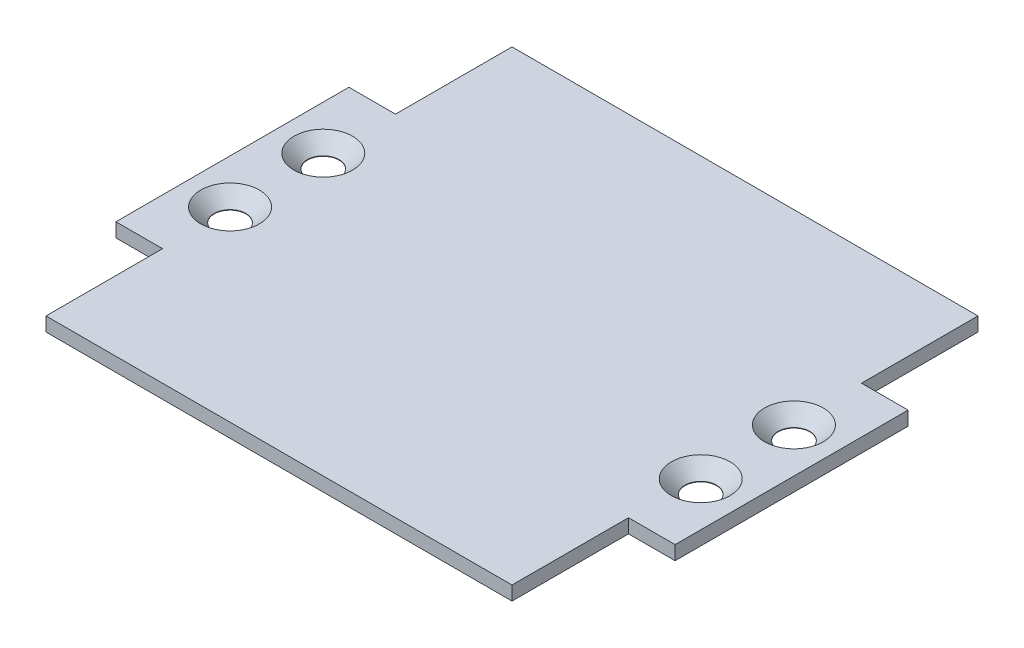
ISO-10303-21;
HEADER;
FILE_DESCRIPTION(('STEP AP214'),'2;1');
FILE_NAME('part.step','',(''),(''),'','','');
FILE_SCHEMA(('AUTOMOTIVE_DESIGN { 1 0 10303 214 1 1 1 1 }'));
ENDSEC;
DATA;
#1=APPLICATION_CONTEXT('core data for automotive mechanical design processes');
#2=APPLICATION_PROTOCOL_DEFINITION('international standard','automotive_design',2000,#1);
#3=PRODUCT_CONTEXT('',#1,'mechanical');
#4=PRODUCT('Part','Part','',(#3));
#5=PRODUCT_RELATED_PRODUCT_CATEGORY('part','',(#4));
#6=PRODUCT_DEFINITION_FORMATION('','',#4);
#7=PRODUCT_DEFINITION_CONTEXT('part definition',#1,'design');
#8=PRODUCT_DEFINITION('design','',#6,#7);
#9=PRODUCT_DEFINITION_SHAPE('','',#8);
#10=(LENGTH_UNIT() NAMED_UNIT(*) SI_UNIT(.MILLI.,.METRE.));
#11=(NAMED_UNIT(*) PLANE_ANGLE_UNIT() SI_UNIT($,.RADIAN.));
#12=(NAMED_UNIT(*) SI_UNIT($,.STERADIAN.) SOLID_ANGLE_UNIT());
#13=UNCERTAINTY_MEASURE_WITH_UNIT(LENGTH_MEASURE(1.E-05),#10,'distance_accuracy_value','');
#14=(GEOMETRIC_REPRESENTATION_CONTEXT(3) GLOBAL_UNCERTAINTY_ASSIGNED_CONTEXT((#13)) GLOBAL_UNIT_ASSIGNED_CONTEXT((#10,
#11,#12)) REPRESENTATION_CONTEXT('',''));
#15=CARTESIAN_POINT('',(0.,0.,0.));
#16=DIRECTION('',(0.,0.,1.));
#17=DIRECTION('',(1.,0.,0.));
#18=AXIS2_PLACEMENT_3D('',#15,#16,#17);
#19=CARTESIAN_POINT('',(12.5,1.5,0.));
#20=DIRECTION('',(1.,0.,0.));
#21=DIRECTION('',(0.,0.,-1.));
#22=AXIS2_PLACEMENT_3D('',#19,#20,#21);
#23=PLANE('',#22);
#24=DIRECTION('',(0.,0.,1.));
#25=VECTOR('',#24,1.);
#26=CARTESIAN_POINT('',(12.5,0.,0.));
#27=LINE('',#26,#25);
#28=CARTESIAN_POINT('',(12.5,0.,-25.));
#29=VERTEX_POINT('',#28);
#30=CARTESIAN_POINT('',(12.5,0.,-12.5));
#31=VERTEX_POINT('',#30);
#32=EDGE_CURVE('E224',#29,#31,#27,.T.);
#33=ORIENTED_EDGE('',*,*,#32,.F.);
#34=DIRECTION('',(0.,-1.,0.));
#35=VECTOR('',#34,1.);
#36=CARTESIAN_POINT('',(12.5,1.5,-25.));
#37=LINE('',#36,#35);
#38=CARTESIAN_POINT('',(12.5,1.5,-25.));
#39=VERTEX_POINT('',#38);
#40=EDGE_CURVE('E12',#39,#29,#37,.T.);
#41=ORIENTED_EDGE('',*,*,#40,.F.);
#42=DIRECTION('',(0.,0.,1.));
#43=VECTOR('',#42,1.);
#44=CARTESIAN_POINT('',(12.5,1.5,0.));
#45=LINE('',#44,#43);
#46=CARTESIAN_POINT('',(12.5,1.5,-12.5));
#47=VERTEX_POINT('',#46);
#48=EDGE_CURVE('E257',#39,#47,#45,.T.);
#49=ORIENTED_EDGE('',*,*,#48,.T.);
#50=DIRECTION('',(0.,-1.,0.));
#51=VECTOR('',#50,1.);
#52=CARTESIAN_POINT('',(12.5,1.5,-12.5));
#53=LINE('',#52,#51);
#54=EDGE_CURVE('E258',#47,#31,#53,.T.);
#55=ORIENTED_EDGE('',*,*,#54,.T.);
#56=EDGE_LOOP('',(#33,#41,#49,#55));
#57=FACE_BOUND('',#56,.T.);
#58=ADVANCED_FACE('F103',(#57),#23,.T.);
#59=CARTESIAN_POINT('',(0.,1.5,-25.));
#60=DIRECTION('',(0.,0.,-1.));
#61=DIRECTION('',(-1.,0.,0.));
#62=AXIS2_PLACEMENT_3D('',#59,#60,#61);
#63=PLANE('',#62);
#64=DIRECTION('',(1.,0.,0.));
#65=VECTOR('',#64,1.);
#66=CARTESIAN_POINT('',(0.,0.,-25.));
#67=LINE('',#66,#65);
#68=CARTESIAN_POINT('',(-37.5,0.,-25.));
#69=VERTEX_POINT('',#68);
#70=EDGE_CURVE('E226',#69,#29,#67,.T.);
#71=ORIENTED_EDGE('',*,*,#70,.F.);
#72=DIRECTION('',(0.,-1.,0.));
#73=VECTOR('',#72,1.);
#74=CARTESIAN_POINT('',(-37.5,1.5,-25.));
#75=LINE('',#74,#73);
#76=CARTESIAN_POINT('',(-37.5,1.5,-25.));
#77=VERTEX_POINT('',#76);
#78=EDGE_CURVE('E222',#77,#69,#75,.T.);
#79=ORIENTED_EDGE('',*,*,#78,.F.);
#80=DIRECTION('',(1.,0.,0.));
#81=VECTOR('',#80,1.);
#82=CARTESIAN_POINT('',(0.,1.5,-25.));
#83=LINE('',#82,#81);
#84=EDGE_CURVE('E303',#77,#39,#83,.T.);
#85=ORIENTED_EDGE('',*,*,#84,.T.);
#86=ORIENTED_EDGE('',*,*,#40,.T.);
#87=EDGE_LOOP('',(#71,#79,#85,#86));
#88=FACE_BOUND('',#87,.T.);
#89=ADVANCED_FACE('F302',(#88),#63,.T.);
#90=CARTESIAN_POINT('',(0.,1.5,25.));
#91=DIRECTION('',(0.,0.,-1.));
#92=DIRECTION('',(-1.,0.,0.));
#93=AXIS2_PLACEMENT_3D('',#90,#91,#92);
#94=PLANE('',#93);
#95=DIRECTION('',(1.,0.,0.));
#96=VECTOR('',#95,1.);
#97=CARTESIAN_POINT('',(0.,0.,25.));
#98=LINE('',#97,#96);
#99=CARTESIAN_POINT('',(-37.5,0.,25.));
#100=VERTEX_POINT('',#99);
#101=CARTESIAN_POINT('',(12.5,0.,25.));
#102=VERTEX_POINT('',#101);
#103=EDGE_CURVE('E233',#100,#102,#98,.T.);
#104=ORIENTED_EDGE('',*,*,#103,.T.);
#105=DIRECTION('',(0.,-1.,0.));
#106=VECTOR('',#105,1.);
#107=CARTESIAN_POINT('',(12.5,1.5,25.));
#108=LINE('',#107,#106);
#109=CARTESIAN_POINT('',(12.5,1.5,25.));
#110=VERTEX_POINT('',#109);
#111=EDGE_CURVE('E114',#110,#102,#108,.T.);
#112=ORIENTED_EDGE('',*,*,#111,.F.);
#113=DIRECTION('',(1.,0.,0.));
#114=VECTOR('',#113,1.);
#115=CARTESIAN_POINT('',(0.,1.5,25.));
#116=LINE('',#115,#114);
#117=CARTESIAN_POINT('',(-37.5,1.5,25.));
#118=VERTEX_POINT('',#117);
#119=EDGE_CURVE('E330',#118,#110,#116,.T.);
#120=ORIENTED_EDGE('',*,*,#119,.F.);
#121=DIRECTION('',(0.,-1.,0.));
#122=VECTOR('',#121,1.);
#123=CARTESIAN_POINT('',(-37.5,1.5,25.));
#124=LINE('',#123,#122);
#125=EDGE_CURVE('E277',#118,#100,#124,.T.);
#126=ORIENTED_EDGE('',*,*,#125,.T.);
#127=EDGE_LOOP('',(#104,#112,#120,#126));
#128=FACE_BOUND('',#127,.T.);
#129=ADVANCED_FACE('F328',(#128),#94,.F.);
#130=CARTESIAN_POINT('',(12.5,0.,12.5));
#131=VERTEX_POINT('',#130);
#132=EDGE_CURVE('E228',#131,#102,#27,.T.);
#133=ORIENTED_EDGE('',*,*,#132,.F.);
#134=DIRECTION('',(0.,-1.,0.));
#135=VECTOR('',#134,1.);
#136=CARTESIAN_POINT('',(12.5,1.5,12.5));
#137=LINE('',#136,#135);
#138=CARTESIAN_POINT('',(12.5,1.5,12.5));
#139=VERTEX_POINT('',#138);
#140=EDGE_CURVE('E268',#139,#131,#137,.T.);
#141=ORIENTED_EDGE('',*,*,#140,.F.);
#142=EDGE_CURVE('E327',#139,#110,#45,.T.);
#143=ORIENTED_EDGE('',*,*,#142,.T.);
#144=ORIENTED_EDGE('',*,*,#111,.T.);
#145=EDGE_LOOP('',(#133,#141,#143,#144));
#146=FACE_BOUND('',#145,.T.);
#147=ADVANCED_FACE('F325',(#146),#23,.T.);
#148=CARTESIAN_POINT('',(0.,1.5,12.5));
#149=DIRECTION('',(0.,0.,1.));
#150=DIRECTION('',(1.,0.,0.));
#151=AXIS2_PLACEMENT_3D('',#148,#149,#150);
#152=PLANE('',#151);
#153=DIRECTION('',(-1.,0.,0.));
#154=VECTOR('',#153,1.);
#155=CARTESIAN_POINT('',(0.,0.,12.5));
#156=LINE('',#155,#154);
#157=CARTESIAN_POINT('',(17.5,0.,12.5));
#158=VERTEX_POINT('',#157);
#159=EDGE_CURVE('E238',#158,#131,#156,.T.);
#160=ORIENTED_EDGE('',*,*,#159,.F.);
#161=DIRECTION('',(0.,-1.,0.));
#162=VECTOR('',#161,1.);
#163=CARTESIAN_POINT('',(17.5,1.5,12.5));
#164=LINE('',#163,#162);
#165=CARTESIAN_POINT('',(17.5,1.5,12.5));
#166=VERTEX_POINT('',#165);
#167=EDGE_CURVE('E265',#166,#158,#164,.T.);
#168=ORIENTED_EDGE('',*,*,#167,.F.);
#169=DIRECTION('',(-1.,0.,0.));
#170=VECTOR('',#169,1.);
#171=CARTESIAN_POINT('',(0.,1.5,12.5));
#172=LINE('',#171,#170);
#173=EDGE_CURVE('E321',#166,#139,#172,.T.);
#174=ORIENTED_EDGE('',*,*,#173,.T.);
#175=ORIENTED_EDGE('',*,*,#140,.T.);
#176=EDGE_LOOP('',(#160,#168,#174,#175));
#177=FACE_BOUND('',#176,.T.);
#178=ADVANCED_FACE('F315',(#177),#152,.T.);
#179=CARTESIAN_POINT('',(17.5,1.5,0.));
#180=DIRECTION('',(-1.,0.,0.));
#181=DIRECTION('',(0.,0.,1.));
#182=AXIS2_PLACEMENT_3D('',#179,#180,#181);
#183=PLANE('',#182);
#184=DIRECTION('',(0.,0.,-1.));
#185=VECTOR('',#184,1.);
#186=CARTESIAN_POINT('',(17.5,0.,0.));
#187=LINE('',#186,#185);
#188=CARTESIAN_POINT('',(17.5,0.,-12.5));
#189=VERTEX_POINT('',#188);
#190=EDGE_CURVE('E243',#158,#189,#187,.T.);
#191=ORIENTED_EDGE('',*,*,#190,.T.);
#192=DIRECTION('',(0.,-1.,0.));
#193=VECTOR('',#192,1.);
#194=CARTESIAN_POINT('',(17.5,1.5,-12.5));
#195=LINE('',#194,#193);
#196=CARTESIAN_POINT('',(17.5,1.5,-12.5));
#197=VERTEX_POINT('',#196);
#198=EDGE_CURVE('E261',#197,#189,#195,.T.);
#199=ORIENTED_EDGE('',*,*,#198,.F.);
#200=DIRECTION('',(0.,0.,-1.));
#201=VECTOR('',#200,1.);
#202=CARTESIAN_POINT('',(17.5,1.5,0.));
#203=LINE('',#202,#201);
#204=EDGE_CURVE('E347',#166,#197,#203,.T.);
#205=ORIENTED_EDGE('',*,*,#204,.F.);
#206=ORIENTED_EDGE('',*,*,#167,.T.);
#207=EDGE_LOOP('',(#191,#199,#205,#206));
#208=FACE_BOUND('',#207,.T.);
#209=ADVANCED_FACE('F350',(#208),#183,.F.);
#210=CARTESIAN_POINT('',(0.,1.5,-12.5));
#211=DIRECTION('',(0.,0.,1.));
#212=DIRECTION('',(1.,0.,0.));
#213=AXIS2_PLACEMENT_3D('',#210,#211,#212);
#214=PLANE('',#213);
#215=DIRECTION('',(-1.,0.,0.));
#216=VECTOR('',#215,1.);
#217=CARTESIAN_POINT('',(0.,0.,-12.5));
#218=LINE('',#217,#216);
#219=EDGE_CURVE('E253',#189,#31,#218,.T.);
#220=ORIENTED_EDGE('',*,*,#219,.T.);
#221=ORIENTED_EDGE('',*,*,#54,.F.);
#222=DIRECTION('',(-1.,0.,0.));
#223=VECTOR('',#222,1.);
#224=CARTESIAN_POINT('',(0.,1.5,-12.5));
#225=LINE('',#224,#223);
#226=EDGE_CURVE('E123',#197,#47,#225,.T.);
#227=ORIENTED_EDGE('',*,*,#226,.F.);
#228=ORIENTED_EDGE('',*,*,#198,.T.);
#229=EDGE_LOOP('',(#220,#221,#227,#228));
#230=FACE_BOUND('',#229,.T.);
#231=ADVANCED_FACE('F308',(#230),#214,.F.);
#232=CARTESIAN_POINT('',(0.,1.5,0.));
#233=DIRECTION('',(0.,1.,0.));
#234=DIRECTION('',(0.,0.,1.));
#235=AXIS2_PLACEMENT_3D('',#232,#233,#234);
#236=PLANE('',#235);
#237=CARTESIAN_POINT('',(12.75,1.5,5.));
#238=DIRECTION('',(0.,1.,0.));
#239=DIRECTION('',(0.,0.,1.));
#240=AXIS2_PLACEMENT_3D('',#237,#238,#239);
#241=CIRCLE('',#240,3.15);
#242=CARTESIAN_POINT('',(12.75,1.5,8.15));
#243=VERTEX_POINT('',#242);
#244=EDGE_CURVE('E561',#243,#243,#241,.T.);
#245=ORIENTED_EDGE('',*,*,#244,.F.);
#246=EDGE_LOOP('',(#245));
#247=FACE_BOUND('',#246,.T.);
#248=CARTESIAN_POINT('',(12.75,1.5,-5.));
#249=DIRECTION('',(0.,1.,0.));
#250=DIRECTION('',(0.,0.,1.));
#251=AXIS2_PLACEMENT_3D('',#248,#249,#250);
#252=CIRCLE('',#251,3.15);
#253=CARTESIAN_POINT('',(12.75,1.5,-1.85));
#254=VERTEX_POINT('',#253);
#255=EDGE_CURVE('E571',#254,#254,#252,.T.);
#256=ORIENTED_EDGE('',*,*,#255,.F.);
#257=EDGE_LOOP('',(#256));
#258=FACE_BOUND('',#257,.T.);
#259=CARTESIAN_POINT('',(-37.75,1.5,-5.));
#260=DIRECTION('',(0.,1.,0.));
#261=DIRECTION('',(0.,0.,1.));
#262=AXIS2_PLACEMENT_3D('',#259,#260,#261);
#263=CIRCLE('',#262,3.15);
#264=CARTESIAN_POINT('',(-37.75,1.5,-1.85));
#265=VERTEX_POINT('',#264);
#266=EDGE_CURVE('E583',#265,#265,#263,.T.);
#267=ORIENTED_EDGE('',*,*,#266,.F.);
#268=EDGE_LOOP('',(#267));
#269=FACE_BOUND('',#268,.T.);
#270=CARTESIAN_POINT('',(-37.75,1.5,5.));
#271=DIRECTION('',(0.,1.,0.));
#272=DIRECTION('',(0.,0.,1.));
#273=AXIS2_PLACEMENT_3D('',#270,#271,#272);
#274=CIRCLE('',#273,3.15);
#275=CARTESIAN_POINT('',(-37.75,1.5,8.15));
#276=VERTEX_POINT('',#275);
#277=EDGE_CURVE('E595',#276,#276,#274,.T.);
#278=ORIENTED_EDGE('',*,*,#277,.F.);
#279=EDGE_LOOP('',(#278));
#280=FACE_BOUND('',#279,.T.);
#281=ORIENTED_EDGE('',*,*,#48,.F.);
#282=ORIENTED_EDGE('',*,*,#84,.F.);
#283=DIRECTION('',(0.,0.,-1.));
#284=VECTOR('',#283,1.);
#285=CARTESIAN_POINT('',(-37.5,1.5,25.));
#286=LINE('',#285,#284);
#287=CARTESIAN_POINT('',(-37.5,1.5,-12.5));
#288=VERTEX_POINT('',#287);
#289=EDGE_CURVE('E278',#288,#77,#286,.T.);
#290=ORIENTED_EDGE('',*,*,#289,.F.);
#291=DIRECTION('',(-1.,0.,0.));
#292=VECTOR('',#291,1.);
#293=CARTESIAN_POINT('',(-37.5,1.5,-12.5));
#294=LINE('',#293,#292);
#295=CARTESIAN_POINT('',(-42.5,1.5,-12.5));
#296=VERTEX_POINT('',#295);
#297=EDGE_CURVE('E290',#288,#296,#294,.T.);
#298=ORIENTED_EDGE('',*,*,#297,.T.);
#299=DIRECTION('',(0.,0.,1.));
#300=VECTOR('',#299,1.);
#301=CARTESIAN_POINT('',(-42.5,1.5,-12.5));
#302=LINE('',#301,#300);
#303=CARTESIAN_POINT('',(-42.5,1.5,12.5));
#304=VERTEX_POINT('',#303);
#305=EDGE_CURVE('E205',#296,#304,#302,.T.);
#306=ORIENTED_EDGE('',*,*,#305,.T.);
#307=DIRECTION('',(-1.,0.,0.));
#308=VECTOR('',#307,1.);
#309=CARTESIAN_POINT('',(-37.5,1.5,12.5));
#310=LINE('',#309,#308);
#311=CARTESIAN_POINT('',(-37.5,1.5,12.5));
#312=VERTEX_POINT('',#311);
#313=EDGE_CURVE('E199',#312,#304,#310,.T.);
#314=ORIENTED_EDGE('',*,*,#313,.F.);
#315=EDGE_CURVE('E273',#118,#312,#286,.T.);
#316=ORIENTED_EDGE('',*,*,#315,.F.);
#317=ORIENTED_EDGE('',*,*,#119,.T.);
#318=ORIENTED_EDGE('',*,*,#142,.F.);
#319=ORIENTED_EDGE('',*,*,#173,.F.);
#320=ORIENTED_EDGE('',*,*,#204,.T.);
#321=ORIENTED_EDGE('',*,*,#226,.T.);
#322=EDGE_LOOP('',(#281,#282,#290,#298,#306,#314,#316,#317,#318,#319,#320,#321));
#323=FACE_BOUND('',#322,.T.);
#324=ADVANCED_FACE('F336',(#247,#258,#269,#280,#323),#236,.T.);
#325=CARTESIAN_POINT('',(0.,0.,0.));
#326=DIRECTION('',(0.,1.,0.));
#327=DIRECTION('',(0.,0.,1.));
#328=AXIS2_PLACEMENT_3D('',#325,#326,#327);
#329=PLANE('',#328);
#330=CARTESIAN_POINT('',(12.75,0.,5.));
#331=DIRECTION('',(0.,1.,0.));
#332=DIRECTION('',(0.,0.,1.));
#333=AXIS2_PLACEMENT_3D('',#330,#331,#332);
#334=CIRCLE('',#333,1.7);
#335=CARTESIAN_POINT('',(12.75,0.,6.7));
#336=VERTEX_POINT('',#335);
#337=EDGE_CURVE('E565',#336,#336,#334,.T.);
#338=ORIENTED_EDGE('',*,*,#337,.T.);
#339=EDGE_LOOP('',(#338));
#340=FACE_BOUND('',#339,.T.);
#341=CARTESIAN_POINT('',(12.75,0.,-5.));
#342=DIRECTION('',(0.,1.,0.));
#343=DIRECTION('',(0.,0.,1.));
#344=AXIS2_PLACEMENT_3D('',#341,#342,#343);
#345=CIRCLE('',#344,1.7);
#346=CARTESIAN_POINT('',(12.75,0.,-3.3));
#347=VERTEX_POINT('',#346);
#348=EDGE_CURVE('E579',#347,#347,#345,.T.);
#349=ORIENTED_EDGE('',*,*,#348,.T.);
#350=EDGE_LOOP('',(#349));
#351=FACE_BOUND('',#350,.T.);
#352=CARTESIAN_POINT('',(-37.75,0.,-5.));
#353=DIRECTION('',(0.,1.,0.));
#354=DIRECTION('',(0.,0.,1.));
#355=AXIS2_PLACEMENT_3D('',#352,#353,#354);
#356=CIRCLE('',#355,1.7);
#357=CARTESIAN_POINT('',(-37.75,0.,-3.3));
#358=VERTEX_POINT('',#357);
#359=EDGE_CURVE('E591',#358,#358,#356,.T.);
#360=ORIENTED_EDGE('',*,*,#359,.T.);
#361=EDGE_LOOP('',(#360));
#362=FACE_BOUND('',#361,.T.);
#363=CARTESIAN_POINT('',(-37.75,0.,5.));
#364=DIRECTION('',(0.,1.,0.));
#365=DIRECTION('',(0.,0.,1.));
#366=AXIS2_PLACEMENT_3D('',#363,#364,#365);
#367=CIRCLE('',#366,1.7);
#368=CARTESIAN_POINT('',(-37.75,0.,6.7));
#369=VERTEX_POINT('',#368);
#370=EDGE_CURVE('E215',#369,#369,#367,.T.);
#371=ORIENTED_EDGE('',*,*,#370,.T.);
#372=EDGE_LOOP('',(#371));
#373=FACE_BOUND('',#372,.T.);
#374=ORIENTED_EDGE('',*,*,#32,.T.);
#375=ORIENTED_EDGE('',*,*,#219,.F.);
#376=ORIENTED_EDGE('',*,*,#190,.F.);
#377=ORIENTED_EDGE('',*,*,#159,.T.);
#378=ORIENTED_EDGE('',*,*,#132,.T.);
#379=ORIENTED_EDGE('',*,*,#103,.F.);
#380=DIRECTION('',(0.,0.,-1.));
#381=VECTOR('',#380,1.);
#382=CARTESIAN_POINT('',(-37.5,0.,25.));
#383=LINE('',#382,#381);
#384=CARTESIAN_POINT('',(-37.5,0.,12.5));
#385=VERTEX_POINT('',#384);
#386=EDGE_CURVE('E279',#100,#385,#383,.T.);
#387=ORIENTED_EDGE('',*,*,#386,.T.);
#388=DIRECTION('',(-1.,0.,0.));
#389=VECTOR('',#388,1.);
#390=CARTESIAN_POINT('',(-37.5,0.,12.5));
#391=LINE('',#390,#389);
#392=CARTESIAN_POINT('',(-42.5,0.,12.5));
#393=VERTEX_POINT('',#392);
#394=EDGE_CURVE('E211',#385,#393,#391,.T.);
#395=ORIENTED_EDGE('',*,*,#394,.T.);
#396=DIRECTION('',(0.,0.,1.));
#397=VECTOR('',#396,1.);
#398=CARTESIAN_POINT('',(-42.5,0.,-12.5));
#399=LINE('',#398,#397);
#400=CARTESIAN_POINT('',(-42.5,0.,-12.5));
#401=VERTEX_POINT('',#400);
#402=EDGE_CURVE('E200',#401,#393,#399,.T.);
#403=ORIENTED_EDGE('',*,*,#402,.F.);
#404=DIRECTION('',(-1.,0.,0.));
#405=VECTOR('',#404,1.);
#406=CARTESIAN_POINT('',(-37.5,0.,-12.5));
#407=LINE('',#406,#405);
#408=CARTESIAN_POINT('',(-37.5,0.,-12.5));
#409=VERTEX_POINT('',#408);
#410=EDGE_CURVE('E187',#409,#401,#407,.T.);
#411=ORIENTED_EDGE('',*,*,#410,.F.);
#412=EDGE_CURVE('E207',#409,#69,#383,.T.);
#413=ORIENTED_EDGE('',*,*,#412,.T.);
#414=ORIENTED_EDGE('',*,*,#70,.T.);
#415=EDGE_LOOP('',(#374,#375,#376,#377,#378,#379,#387,#395,#403,#411,#413,#414));
#416=FACE_BOUND('',#415,.T.);
#417=ADVANCED_FACE('F209',(#340,#351,#362,#373,#416),#329,.F.);
#418=CARTESIAN_POINT('',(-42.5,1.5,-12.5));
#419=DIRECTION('',(1.,0.,0.));
#420=DIRECTION('',(0.,0.,-1.));
#421=AXIS2_PLACEMENT_3D('',#418,#419,#420);
#422=PLANE('',#421);
#423=ORIENTED_EDGE('',*,*,#402,.T.);
#424=DIRECTION('',(0.,-1.,0.));
#425=VECTOR('',#424,1.);
#426=CARTESIAN_POINT('',(-42.5,1.5,12.5));
#427=LINE('',#426,#425);
#428=EDGE_CURVE('E107',#304,#393,#427,.T.);
#429=ORIENTED_EDGE('',*,*,#428,.F.);
#430=ORIENTED_EDGE('',*,*,#305,.F.);
#431=DIRECTION('',(0.,-1.,0.));
#432=VECTOR('',#431,1.);
#433=CARTESIAN_POINT('',(-42.5,1.5,-12.5));
#434=LINE('',#433,#432);
#435=EDGE_CURVE('E191',#296,#401,#434,.T.);
#436=ORIENTED_EDGE('',*,*,#435,.T.);
#437=EDGE_LOOP('',(#423,#429,#430,#436));
#438=FACE_BOUND('',#437,.T.);
#439=ADVANCED_FACE('F203',(#438),#422,.F.);
#440=CARTESIAN_POINT('',(-37.5,1.5,12.5));
#441=DIRECTION('',(0.,0.,1.));
#442=DIRECTION('',(1.,0.,0.));
#443=AXIS2_PLACEMENT_3D('',#440,#441,#442);
#444=PLANE('',#443);
#445=ORIENTED_EDGE('',*,*,#394,.F.);
#446=DIRECTION('',(0.,-1.,0.));
#447=VECTOR('',#446,1.);
#448=CARTESIAN_POINT('',(-37.5,1.5,12.5));
#449=LINE('',#448,#447);
#450=EDGE_CURVE('E219',#312,#385,#449,.T.);
#451=ORIENTED_EDGE('',*,*,#450,.F.);
#452=ORIENTED_EDGE('',*,*,#313,.T.);
#453=ORIENTED_EDGE('',*,*,#428,.T.);
#454=EDGE_LOOP('',(#445,#451,#452,#453));
#455=FACE_BOUND('',#454,.T.);
#456=ADVANCED_FACE('F105',(#455),#444,.T.);
#457=CARTESIAN_POINT('',(-37.5,1.5,-12.5));
#458=DIRECTION('',(0.,0.,1.));
#459=DIRECTION('',(1.,0.,0.));
#460=AXIS2_PLACEMENT_3D('',#457,#458,#459);
#461=PLANE('',#460);
#462=ORIENTED_EDGE('',*,*,#410,.T.);
#463=ORIENTED_EDGE('',*,*,#435,.F.);
#464=ORIENTED_EDGE('',*,*,#297,.F.);
#465=DIRECTION('',(0.,-1.,0.));
#466=VECTOR('',#465,1.);
#467=CARTESIAN_POINT('',(-37.5,1.5,-12.5));
#468=LINE('',#467,#466);
#469=EDGE_CURVE('E193',#288,#409,#468,.T.);
#470=ORIENTED_EDGE('',*,*,#469,.T.);
#471=EDGE_LOOP('',(#462,#463,#464,#470));
#472=FACE_BOUND('',#471,.T.);
#473=ADVANCED_FACE('F189',(#472),#461,.F.);
#474=CARTESIAN_POINT('',(-37.5,1.5,25.));
#475=DIRECTION('',(-1.,0.,0.));
#476=DIRECTION('',(0.,0.,1.));
#477=AXIS2_PLACEMENT_3D('',#474,#475,#476);
#478=PLANE('',#477);
#479=ORIENTED_EDGE('',*,*,#315,.T.);
#480=ORIENTED_EDGE('',*,*,#450,.T.);
#481=ORIENTED_EDGE('',*,*,#386,.F.);
#482=ORIENTED_EDGE('',*,*,#125,.F.);
#483=EDGE_LOOP('',(#479,#480,#481,#482));
#484=FACE_BOUND('',#483,.T.);
#485=ADVANCED_FACE('F359',(#484),#478,.T.);
#486=ORIENTED_EDGE('',*,*,#469,.F.);
#487=ORIENTED_EDGE('',*,*,#289,.T.);
#488=ORIENTED_EDGE('',*,*,#78,.T.);
#489=ORIENTED_EDGE('',*,*,#412,.F.);
#490=EDGE_LOOP('',(#486,#487,#488,#489));
#491=FACE_BOUND('',#490,.T.);
#492=ADVANCED_FACE('F299',(#491),#478,.T.);
#493=CARTESIAN_POINT('',(-37.75,1.5,5.));
#494=DIRECTION('',(0.,1.,0.));
#495=DIRECTION('',(0.,0.,1.));
#496=AXIS2_PLACEMENT_3D('',#493,#494,#495);
#497=CYLINDRICAL_SURFACE('',#496,1.69999999999999);
#498=ORIENTED_EDGE('',*,*,#370,.F.);
#499=EDGE_LOOP('',(#498));
#500=FACE_BOUND('',#499,.T.);
#501=CARTESIAN_POINT('',(-37.75,0.0499999999999932,5.));
#502=DIRECTION('',(0.,1.,0.));
#503=DIRECTION('',(0.,0.,1.));
#504=AXIS2_PLACEMENT_3D('',#501,#502,#503);
#505=CIRCLE('',#504,1.69999999999999);
#506=CARTESIAN_POINT('',(-37.75,0.0499999999999932,6.69999999999999));
#507=VERTEX_POINT('',#506);
#508=EDGE_CURVE('E599',#507,#507,#505,.T.);
#509=ORIENTED_EDGE('',*,*,#508,.T.);
#510=EDGE_LOOP('',(#509));
#511=FACE_BOUND('',#510,.T.);
#512=ADVANCED_FACE('F367',(#500,#511),#497,.F.);
#513=CARTESIAN_POINT('',(-37.75,1.5,5.));
#514=DIRECTION('',(0.,1.,0.));
#515=DIRECTION('',(0.,0.,1.));
#516=AXIS2_PLACEMENT_3D('',#513,#514,#515);
#517=CONICAL_SURFACE('',#516,3.15,0.78539816339745);
#518=ORIENTED_EDGE('',*,*,#508,.F.);
#519=EDGE_LOOP('',(#518));
#520=FACE_BOUND('',#519,.T.);
#521=ORIENTED_EDGE('',*,*,#277,.T.);
#522=EDGE_LOOP('',(#521));
#523=FACE_BOUND('',#522,.T.);
#524=ADVANCED_FACE('F481',(#520,#523),#517,.F.);
#525=CARTESIAN_POINT('',(-37.75,1.5,-5.));
#526=DIRECTION('',(0.,1.,0.));
#527=DIRECTION('',(0.,0.,1.));
#528=AXIS2_PLACEMENT_3D('',#525,#526,#527);
#529=CYLINDRICAL_SURFACE('',#528,1.69999999999999);
#530=ORIENTED_EDGE('',*,*,#359,.F.);
#531=EDGE_LOOP('',(#530));
#532=FACE_BOUND('',#531,.T.);
#533=CARTESIAN_POINT('',(-37.75,0.0499999999999932,-5.));
#534=DIRECTION('',(0.,1.,0.));
#535=DIRECTION('',(0.,0.,1.));
#536=AXIS2_PLACEMENT_3D('',#533,#534,#535);
#537=CIRCLE('',#536,1.69999999999999);
#538=CARTESIAN_POINT('',(-37.75,0.0499999999999932,-3.30000000000001));
#539=VERTEX_POINT('',#538);
#540=EDGE_CURVE('E587',#539,#539,#537,.T.);
#541=ORIENTED_EDGE('',*,*,#540,.T.);
#542=EDGE_LOOP('',(#541));
#543=FACE_BOUND('',#542,.T.);
#544=ADVANCED_FACE('F490',(#532,#543),#529,.F.);
#545=CARTESIAN_POINT('',(-37.75,1.5,-5.));
#546=DIRECTION('',(0.,1.,0.));
#547=DIRECTION('',(0.,0.,1.));
#548=AXIS2_PLACEMENT_3D('',#545,#546,#547);
#549=CONICAL_SURFACE('',#548,3.15,0.78539816339745);
#550=ORIENTED_EDGE('',*,*,#540,.F.);
#551=EDGE_LOOP('',(#550));
#552=FACE_BOUND('',#551,.T.);
#553=ORIENTED_EDGE('',*,*,#266,.T.);
#554=EDGE_LOOP('',(#553));
#555=FACE_BOUND('',#554,.T.);
#556=ADVANCED_FACE('F499',(#552,#555),#549,.F.);
#557=CARTESIAN_POINT('',(12.75,1.5,-5.));
#558=DIRECTION('',(0.,1.,0.));
#559=DIRECTION('',(0.,0.,1.));
#560=AXIS2_PLACEMENT_3D('',#557,#558,#559);
#561=CYLINDRICAL_SURFACE('',#560,1.69999999999999);
#562=ORIENTED_EDGE('',*,*,#348,.F.);
#563=EDGE_LOOP('',(#562));
#564=FACE_BOUND('',#563,.T.);
#565=CARTESIAN_POINT('',(12.75,0.0499999999999932,-5.));
#566=DIRECTION('',(0.,1.,0.));
#567=DIRECTION('',(0.,0.,1.));
#568=AXIS2_PLACEMENT_3D('',#565,#566,#567);
#569=CIRCLE('',#568,1.69999999999999);
#570=CARTESIAN_POINT('',(12.75,0.0499999999999932,-3.30000000000001));
#571=VERTEX_POINT('',#570);
#572=EDGE_CURVE('E575',#571,#571,#569,.T.);
#573=ORIENTED_EDGE('',*,*,#572,.T.);
#574=EDGE_LOOP('',(#573));
#575=FACE_BOUND('',#574,.T.);
#576=ADVANCED_FACE('F508',(#564,#575),#561,.F.);
#577=CARTESIAN_POINT('',(12.75,1.5,-5.));
#578=DIRECTION('',(0.,1.,0.));
#579=DIRECTION('',(0.,0.,1.));
#580=AXIS2_PLACEMENT_3D('',#577,#578,#579);
#581=CONICAL_SURFACE('',#580,3.15,0.78539816339745);
#582=ORIENTED_EDGE('',*,*,#572,.F.);
#583=EDGE_LOOP('',(#582));
#584=FACE_BOUND('',#583,.T.);
#585=ORIENTED_EDGE('',*,*,#255,.T.);
#586=EDGE_LOOP('',(#585));
#587=FACE_BOUND('',#586,.T.);
#588=ADVANCED_FACE('F517',(#584,#587),#581,.F.);
#589=CARTESIAN_POINT('',(12.75,1.5,5.));
#590=DIRECTION('',(0.,1.,0.));
#591=DIRECTION('',(0.,0.,1.));
#592=AXIS2_PLACEMENT_3D('',#589,#590,#591);
#593=CYLINDRICAL_SURFACE('',#592,1.69999999999999);
#594=ORIENTED_EDGE('',*,*,#337,.F.);
#595=EDGE_LOOP('',(#594));
#596=FACE_BOUND('',#595,.T.);
#597=CARTESIAN_POINT('',(12.75,0.0499999999999932,5.));
#598=DIRECTION('',(0.,1.,0.));
#599=DIRECTION('',(0.,0.,1.));
#600=AXIS2_PLACEMENT_3D('',#597,#598,#599);
#601=CIRCLE('',#600,1.69999999999999);
#602=CARTESIAN_POINT('',(12.75,0.0499999999999932,6.69999999999999));
#603=VERTEX_POINT('',#602);
#604=EDGE_CURVE('E558',#603,#603,#601,.T.);
#605=ORIENTED_EDGE('',*,*,#604,.T.);
#606=EDGE_LOOP('',(#605));
#607=FACE_BOUND('',#606,.T.);
#608=ADVANCED_FACE('F526',(#596,#607),#593,.F.);
#609=CARTESIAN_POINT('',(12.75,1.5,5.));
#610=DIRECTION('',(0.,1.,0.));
#611=DIRECTION('',(0.,0.,1.));
#612=AXIS2_PLACEMENT_3D('',#609,#610,#611);
#613=CONICAL_SURFACE('',#612,3.15,0.78539816339745);
#614=ORIENTED_EDGE('',*,*,#604,.F.);
#615=EDGE_LOOP('',(#614));
#616=FACE_BOUND('',#615,.T.);
#617=ORIENTED_EDGE('',*,*,#244,.T.);
#618=EDGE_LOOP('',(#617));
#619=FACE_BOUND('',#618,.T.);
#620=ADVANCED_FACE('F535',(#616,#619),#613,.F.);
#621=CLOSED_SHELL('',(#58,#89,#129,#147,#178,#209,#231,#324,#417,#439,#456,#473,#485,#492,#512,
#524,#544,#556,#576,#588,#608,#620));
#622=MANIFOLD_SOLID_BREP('B2',#621);
#623=ADVANCED_BREP_SHAPE_REPRESENTATION('',(#18,#622),#14);
#624=SHAPE_DEFINITION_REPRESENTATION(#9,#623);
ENDSEC;
END-ISO-10303-21;
